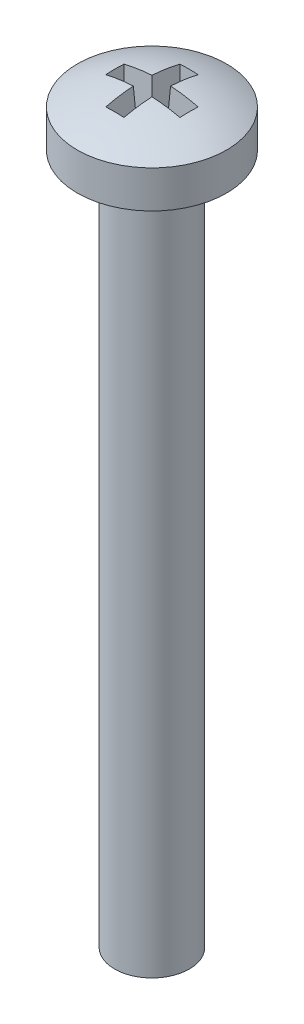
ISO-10303-21;
HEADER;
FILE_DESCRIPTION(('STEP AP214'),'2;1');
FILE_NAME('part.step','',(''),(''),'','','');
FILE_SCHEMA(('AUTOMOTIVE_DESIGN { 1 0 10303 214 1 1 1 1 }'));
ENDSEC;
DATA;
#1=APPLICATION_CONTEXT('core data for automotive mechanical design processes');
#2=APPLICATION_PROTOCOL_DEFINITION('international standard','automotive_design',2000,#1);
#3=PRODUCT_CONTEXT('',#1,'mechanical');
#4=PRODUCT('Part','Part','',(#3));
#5=PRODUCT_RELATED_PRODUCT_CATEGORY('part','',(#4));
#6=PRODUCT_DEFINITION_FORMATION('','',#4);
#7=PRODUCT_DEFINITION_CONTEXT('part definition',#1,'design');
#8=PRODUCT_DEFINITION('design','',#6,#7);
#9=PRODUCT_DEFINITION_SHAPE('','',#8);
#10=(LENGTH_UNIT() NAMED_UNIT(*) SI_UNIT(.MILLI.,.METRE.));
#11=(NAMED_UNIT(*) PLANE_ANGLE_UNIT() SI_UNIT($,.RADIAN.));
#12=(NAMED_UNIT(*) SI_UNIT($,.STERADIAN.) SOLID_ANGLE_UNIT());
#13=UNCERTAINTY_MEASURE_WITH_UNIT(LENGTH_MEASURE(1.E-05),#10,'distance_accuracy_value','');
#14=(GEOMETRIC_REPRESENTATION_CONTEXT(3) GLOBAL_UNCERTAINTY_ASSIGNED_CONTEXT((#13)) GLOBAL_UNIT_ASSIGNED_CONTEXT((#10,
#11,#12)) REPRESENTATION_CONTEXT('',''));
#15=CARTESIAN_POINT('',(0.,0.,0.));
#16=DIRECTION('',(0.,0.,1.));
#17=DIRECTION('',(1.,0.,0.));
#18=AXIS2_PLACEMENT_3D('',#15,#16,#17);
#19=CARTESIAN_POINT('',(0.,31.5,0.));
#20=DIRECTION('',(0.,0.,1.));
#21=DIRECTION('',(1.,0.,0.));
#22=AXIS2_PLACEMENT_3D('',#19,#20,#21);
#23=SPHERICAL_SURFACE('',#22,8.49999999999999);
#24=CARTESIAN_POINT('',(0.,39.,0.));
#25=DIRECTION('',(0.,1.,0.));
#26=DIRECTION('',(0.,0.,1.));
#27=AXIS2_PLACEMENT_3D('',#24,#25,#26);
#28=CIRCLE('',#27,4.);
#29=CARTESIAN_POINT('',(0.,39.,4.));
#30=VERTEX_POINT('',#29);
#31=EDGE_CURVE('E140',#30,#30,#28,.T.);
#32=ORIENTED_EDGE('',*,*,#31,.T.);
#33=EDGE_LOOP('',(#32));
#34=FACE_BOUND('',#33,.T.);
#35=CARTESIAN_POINT('',(0.,31.4187534814172,-1.55027592648074));
#36=DIRECTION('',(0.,-0.0523359562429439,-0.998629534754574));
#37=DIRECTION('',(0.,0.998629534754574,-0.052335956242944));
#38=AXIS2_PLACEMENT_3D('',#35,#36,#37);
#39=CIRCLE('',#38,8.35703557219857);
#40=CARTESIAN_POINT('',(-0.486906393173518,39.7501590984085,-1.98690639317351));
#41=VERTEX_POINT('',#40);
#42=CARTESIAN_POINT('',(0.486906393173518,39.7501590984085,-1.98690639317351));
#43=VERTEX_POINT('',#42);
#44=EDGE_CURVE('E194',#41,#43,#39,.T.);
#45=ORIENTED_EDGE('',*,*,#44,.T.);
#46=CARTESIAN_POINT('',(0.0543845049545404,31.4971498288679,0.));
#47=DIRECTION('',(0.998629534754574,-0.0523359562429439,0.));
#48=DIRECTION('',(0.052335956242944,0.998629534754574,0.));
#49=AXIS2_PLACEMENT_3D('',#46,#47,#48);
#50=CIRCLE('',#49,8.49982553951228);
#51=CARTESIAN_POINT('',(0.498465398677198,39.9707180623984,-0.498465398677195));
#52=VERTEX_POINT('',#51);
#53=EDGE_CURVE('E11',#43,#52,#50,.T.);
#54=ORIENTED_EDGE('',*,*,#53,.T.);
#55=CARTESIAN_POINT('',(0.,31.4971498288679,-0.054384504954538));
#56=DIRECTION('',(0.,-0.0523359562429439,-0.998629534754574));
#57=DIRECTION('',(0.,0.998629534754574,-0.052335956242944));
#58=AXIS2_PLACEMENT_3D('',#55,#56,#57);
#59=CIRCLE('',#58,8.49982553951228);
#60=CARTESIAN_POINT('',(1.98690639317352,39.7501590984085,-0.486906393173514));
#61=VERTEX_POINT('',#60);
#62=EDGE_CURVE('E40',#52,#61,#59,.T.);
#63=ORIENTED_EDGE('',*,*,#62,.T.);
#64=CARTESIAN_POINT('',(1.55027592648075,31.4187534814172,0.));
#65=DIRECTION('',(0.998629534754574,-0.0523359562429439,0.));
#66=DIRECTION('',(0.052335956242944,0.998629534754574,0.));
#67=AXIS2_PLACEMENT_3D('',#64,#65,#66);
#68=CIRCLE('',#67,8.35703557219857);
#69=CARTESIAN_POINT('',(1.98690639317352,39.7501590984085,0.486906393173521));
#70=VERTEX_POINT('',#69);
#71=EDGE_CURVE('E226',#61,#70,#68,.T.);
#72=ORIENTED_EDGE('',*,*,#71,.T.);
#73=CARTESIAN_POINT('',(0.,31.4971498288679,0.0543845049545434));
#74=DIRECTION('',(0.,-0.0523359562429439,0.998629534754574));
#75=DIRECTION('',(0.,-0.998629534754574,-0.052335956242944));
#76=AXIS2_PLACEMENT_3D('',#73,#74,#75);
#77=CIRCLE('',#76,8.49982553951228);
#78=CARTESIAN_POINT('',(0.498465398677197,39.9707180623984,0.498465398677201));
#79=VERTEX_POINT('',#78);
#80=EDGE_CURVE('E223',#70,#79,#77,.T.);
#81=ORIENTED_EDGE('',*,*,#80,.T.);
#82=CARTESIAN_POINT('',(0.0543845049545401,31.4971498288679,0.));
#83=DIRECTION('',(0.998629534754574,-0.0523359562429439,0.));
#84=DIRECTION('',(0.052335956242944,0.998629534754574,0.));
#85=AXIS2_PLACEMENT_3D('',#82,#83,#84);
#86=CIRCLE('',#85,8.49982553951228);
#87=CARTESIAN_POINT('',(0.486906393173517,39.7501590984085,1.98690639317352));
#88=VERTEX_POINT('',#87);
#89=EDGE_CURVE('E220',#79,#88,#86,.T.);
#90=ORIENTED_EDGE('',*,*,#89,.T.);
#91=CARTESIAN_POINT('',(0.,31.4187534814172,1.55027592648075));
#92=DIRECTION('',(0.,-0.0523359562429439,0.998629534754574));
#93=DIRECTION('',(0.,-0.998629534754574,-0.052335956242944));
#94=AXIS2_PLACEMENT_3D('',#91,#92,#93);
#95=CIRCLE('',#94,8.35703557219857);
#96=CARTESIAN_POINT('',(-0.486906393173518,39.7501590984085,1.98690639317352));
#97=VERTEX_POINT('',#96);
#98=EDGE_CURVE('E217',#88,#97,#95,.T.);
#99=ORIENTED_EDGE('',*,*,#98,.T.);
#100=CARTESIAN_POINT('',(-0.0543845049545404,31.4971498288679,0.));
#101=DIRECTION('',(-0.998629534754574,-0.0523359562429439,0.));
#102=DIRECTION('',(0.052335956242944,-0.998629534754574,0.));
#103=AXIS2_PLACEMENT_3D('',#100,#101,#102);
#104=CIRCLE('',#103,8.49982553951228);
#105=CARTESIAN_POINT('',(-0.498465398677198,39.9707180623984,0.4984653986772));
#106=VERTEX_POINT('',#105);
#107=EDGE_CURVE('E214',#97,#106,#104,.T.);
#108=ORIENTED_EDGE('',*,*,#107,.T.);
#109=CARTESIAN_POINT('',(0.,31.4971498288679,0.0543845049545431));
#110=DIRECTION('',(0.,-0.0523359562429439,0.998629534754574));
#111=DIRECTION('',(0.,-0.998629534754574,-0.052335956242944));
#112=AXIS2_PLACEMENT_3D('',#109,#110,#111);
#113=CIRCLE('',#112,8.49982553951228);
#114=CARTESIAN_POINT('',(-1.98690639317352,39.7501590984085,0.48690639317352));
#115=VERTEX_POINT('',#114);
#116=EDGE_CURVE('E211',#106,#115,#113,.T.);
#117=ORIENTED_EDGE('',*,*,#116,.T.);
#118=CARTESIAN_POINT('',(-1.55027592648074,31.4187534814172,0.));
#119=DIRECTION('',(-0.998629534754574,-0.0523359562429439,0.));
#120=DIRECTION('',(0.052335956242944,-0.998629534754574,0.));
#121=AXIS2_PLACEMENT_3D('',#118,#119,#120);
#122=CIRCLE('',#121,8.35703557219857);
#123=CARTESIAN_POINT('',(-1.98690639317352,39.7501590984085,-0.486906393173516));
#124=VERTEX_POINT('',#123);
#125=EDGE_CURVE('E208',#115,#124,#122,.T.);
#126=ORIENTED_EDGE('',*,*,#125,.T.);
#127=CARTESIAN_POINT('',(0.,31.4971498288679,-0.0543845049545381));
#128=DIRECTION('',(0.,-0.0523359562429439,-0.998629534754574));
#129=DIRECTION('',(0.,0.998629534754574,-0.052335956242944));
#130=AXIS2_PLACEMENT_3D('',#127,#128,#129);
#131=CIRCLE('',#130,8.49982553951228);
#132=CARTESIAN_POINT('',(-0.498465398677198,39.9707180623984,-0.498465398677195));
#133=VERTEX_POINT('',#132);
#134=EDGE_CURVE('E205',#124,#133,#131,.T.);
#135=ORIENTED_EDGE('',*,*,#134,.T.);
#136=CARTESIAN_POINT('',(-0.0543845049545404,31.4971498288679,0.));
#137=DIRECTION('',(-0.998629534754574,-0.0523359562429439,0.));
#138=DIRECTION('',(0.052335956242944,-0.998629534754574,0.));
#139=AXIS2_PLACEMENT_3D('',#136,#137,#138);
#140=CIRCLE('',#139,8.49982553951228);
#141=EDGE_CURVE('E202',#133,#41,#140,.T.);
#142=ORIENTED_EDGE('',*,*,#141,.T.);
#143=EDGE_LOOP('',(#45,#54,#63,#72,#81,#90,#99,#108,#117,#126,#135,#142));
#144=FACE_BOUND('',#143,.T.);
#145=ADVANCED_FACE('F33',(#34,#144),#23,.T.);
#146=CARTESIAN_POINT('',(0.,37.,0.));
#147=DIRECTION('',(0.,-1.,0.));
#148=DIRECTION('',(0.,0.,-1.));
#149=AXIS2_PLACEMENT_3D('',#146,#147,#148);
#150=CYLINDRICAL_SURFACE('',#149,2.);
#151=CARTESIAN_POINT('',(0.,37.,0.));
#152=DIRECTION('',(0.,1.,0.));
#153=DIRECTION('',(0.,0.,1.));
#154=AXIS2_PLACEMENT_3D('',#151,#152,#153);
#155=CIRCLE('',#154,2.);
#156=CARTESIAN_POINT('',(0.,37.,2.));
#157=VERTEX_POINT('',#156);
#158=EDGE_CURVE('E191',#157,#157,#155,.T.);
#159=ORIENTED_EDGE('',*,*,#158,.F.);
#160=EDGE_LOOP('',(#159));
#161=FACE_BOUND('',#160,.T.);
#162=CARTESIAN_POINT('',(0.,0.,0.));
#163=DIRECTION('',(0.,1.,0.));
#164=DIRECTION('',(0.,0.,1.));
#165=AXIS2_PLACEMENT_3D('',#162,#163,#164);
#166=CIRCLE('',#165,2.);
#167=CARTESIAN_POINT('',(0.,0.,2.));
#168=VERTEX_POINT('',#167);
#169=EDGE_CURVE('E195',#168,#168,#166,.T.);
#170=ORIENTED_EDGE('',*,*,#169,.T.);
#171=EDGE_LOOP('',(#170));
#172=FACE_BOUND('',#171,.T.);
#173=ADVANCED_FACE('F273',(#161,#172),#150,.T.);
#174=CARTESIAN_POINT('',(0.,0.,0.));
#175=DIRECTION('',(0.,1.,0.));
#176=DIRECTION('',(0.,0.,1.));
#177=AXIS2_PLACEMENT_3D('',#174,#175,#176);
#178=PLANE('',#177);
#179=ORIENTED_EDGE('',*,*,#169,.F.);
#180=EDGE_LOOP('',(#179));
#181=FACE_BOUND('',#180,.T.);
#182=ADVANCED_FACE('F278',(#181),#178,.F.);
#183=CARTESIAN_POINT('',(0.,39.,0.));
#184=DIRECTION('',(0.,-1.,0.));
#185=DIRECTION('',(0.,0.,-1.));
#186=AXIS2_PLACEMENT_3D('',#183,#184,#185);
#187=CYLINDRICAL_SURFACE('',#186,4.);
#188=ORIENTED_EDGE('',*,*,#31,.F.);
#189=EDGE_LOOP('',(#188));
#190=FACE_BOUND('',#189,.T.);
#191=CARTESIAN_POINT('',(0.,37.,0.));
#192=DIRECTION('',(0.,1.,0.));
#193=DIRECTION('',(0.,0.,1.));
#194=AXIS2_PLACEMENT_3D('',#191,#192,#193);
#195=CIRCLE('',#194,4.);
#196=CARTESIAN_POINT('',(0.,37.,4.));
#197=VERTEX_POINT('',#196);
#198=EDGE_CURVE('E136',#197,#197,#195,.T.);
#199=ORIENTED_EDGE('',*,*,#198,.T.);
#200=EDGE_LOOP('',(#199));
#201=FACE_BOUND('',#200,.T.);
#202=ADVANCED_FACE('F282',(#190,#201),#187,.T.);
#203=CARTESIAN_POINT('',(0.,37.,0.));
#204=DIRECTION('',(0.,1.,0.));
#205=DIRECTION('',(0.,0.,1.));
#206=AXIS2_PLACEMENT_3D('',#203,#204,#205);
#207=PLANE('',#206);
#208=ORIENTED_EDGE('',*,*,#158,.T.);
#209=EDGE_LOOP('',(#208));
#210=FACE_BOUND('',#209,.T.);
#211=ORIENTED_EDGE('',*,*,#198,.F.);
#212=EDGE_LOOP('',(#211));
#213=FACE_BOUND('',#212,.T.);
#214=ADVANCED_FACE('F285',(#210,#213),#207,.F.);
#215=CARTESIAN_POINT('',(0.5,40.,-0.499999999999997));
#216=DIRECTION('',(0.998629534754574,-0.0523359562429439,0.));
#217=DIRECTION('',(0.052335956242944,0.998629534754574,0.));
#218=AXIS2_PLACEMENT_3D('',#215,#216,#217);
#219=PLANE('',#218);
#220=DIRECTION('',(0.052264427688714,0.997264688634237,-0.052264427688714));
#221=VECTOR('',#220,1.);
#222=CARTESIAN_POINT('',(0.495902644397557,39.9218177976916,-1.99590264439755));
#223=LINE('',#222,#221);
#224=CARTESIAN_POINT('',(0.342776662150876,37.,-1.84277666215087));
#225=VERTEX_POINT('',#224);
#226=EDGE_CURVE('E47',#225,#43,#223,.T.);
#227=ORIENTED_EDGE('',*,*,#226,.F.);
#228=DIRECTION('',(0.,0.,-1.));
#229=VECTOR('',#228,1.);
#230=CARTESIAN_POINT('',(0.342776662150876,37.,-0.499999999999997));
#231=LINE('',#230,#229);
#232=CARTESIAN_POINT('',(0.342776662150876,37.,-0.342776662150873));
#233=VERTEX_POINT('',#232);
#234=EDGE_CURVE('E126',#225,#233,#231,.F.);
#235=ORIENTED_EDGE('',*,*,#234,.T.);
#236=DIRECTION('',(0.052264427688714,0.997264688634237,-0.052264427688714));
#237=VECTOR('',#236,1.);
#238=CARTESIAN_POINT('',(0.5,40.,-0.499999999999997));
#239=LINE('',#238,#237);
#240=EDGE_CURVE('E133',#233,#52,#239,.T.);
#241=ORIENTED_EDGE('',*,*,#240,.T.);
#242=ORIENTED_EDGE('',*,*,#53,.F.);
#243=EDGE_LOOP('',(#227,#235,#241,#242));
#244=FACE_BOUND('',#243,.T.);
#245=ADVANCED_FACE('F132',(#244),#219,.F.);
#246=CARTESIAN_POINT('',(0.5,40.,-0.499999999999997));
#247=DIRECTION('',(0.,-0.0523359562429439,-0.998629534754574));
#248=DIRECTION('',(0.,0.998629534754574,-0.052335956242944));
#249=AXIS2_PLACEMENT_3D('',#246,#247,#248);
#250=PLANE('',#249);
#251=ORIENTED_EDGE('',*,*,#240,.F.);
#252=DIRECTION('',(-1.,0.,0.));
#253=VECTOR('',#252,1.);
#254=CARTESIAN_POINT('',(0.5,37.,-0.342776662150873));
#255=LINE('',#254,#253);
#256=CARTESIAN_POINT('',(1.84277666215088,37.,-0.342776662150873));
#257=VERTEX_POINT('',#256);
#258=EDGE_CURVE('E122',#233,#257,#255,.F.);
#259=ORIENTED_EDGE('',*,*,#258,.T.);
#260=DIRECTION('',(0.052264427688714,0.997264688634237,-0.052264427688714));
#261=VECTOR('',#260,1.);
#262=CARTESIAN_POINT('',(1.99726842959837,39.9478785317944,-0.497268429598368));
#263=LINE('',#262,#261);
#264=EDGE_CURVE('E137',#257,#61,#263,.T.);
#265=ORIENTED_EDGE('',*,*,#264,.T.);
#266=ORIENTED_EDGE('',*,*,#62,.F.);
#267=EDGE_LOOP('',(#251,#259,#265,#266));
#268=FACE_BOUND('',#267,.T.);
#269=ADVANCED_FACE('F135',(#268),#250,.F.);
#270=CARTESIAN_POINT('',(2.,40.,0.500000000000003));
#271=DIRECTION('',(0.998629534754574,-0.0523359562429439,0.));
#272=DIRECTION('',(0.052335956242944,0.998629534754574,0.));
#273=AXIS2_PLACEMENT_3D('',#270,#271,#272);
#274=PLANE('',#273);
#275=ORIENTED_EDGE('',*,*,#264,.F.);
#276=DIRECTION('',(0.,0.,-1.));
#277=VECTOR('',#276,1.);
#278=CARTESIAN_POINT('',(1.84277666215088,37.,0.500000000000003));
#279=LINE('',#278,#277);
#280=CARTESIAN_POINT('',(1.84277666215088,37.,0.342776662150879));
#281=VERTEX_POINT('',#280);
#282=EDGE_CURVE('E128',#257,#281,#279,.F.);
#283=ORIENTED_EDGE('',*,*,#282,.T.);
#284=DIRECTION('',(0.052264427688714,0.997264688634237,0.052264427688714));
#285=VECTOR('',#284,1.);
#286=CARTESIAN_POINT('',(1.99590264439756,39.9218177976916,0.49590264439756));
#287=LINE('',#286,#285);
#288=EDGE_CURVE('E142',#281,#70,#287,.T.);
#289=ORIENTED_EDGE('',*,*,#288,.T.);
#290=ORIENTED_EDGE('',*,*,#71,.F.);
#291=EDGE_LOOP('',(#275,#283,#289,#290));
#292=FACE_BOUND('',#291,.T.);
#293=ADVANCED_FACE('F263',(#292),#274,.F.);
#294=CARTESIAN_POINT('',(0.5,40.,0.500000000000003));
#295=DIRECTION('',(0.,-0.0523359562429439,0.998629534754574));
#296=DIRECTION('',(0.,-0.998629534754574,-0.052335956242944));
#297=AXIS2_PLACEMENT_3D('',#294,#295,#296);
#298=PLANE('',#297);
#299=ORIENTED_EDGE('',*,*,#288,.F.);
#300=DIRECTION('',(1.,0.,0.));
#301=VECTOR('',#300,1.);
#302=CARTESIAN_POINT('',(0.5,37.,0.342776662150879));
#303=LINE('',#302,#301);
#304=CARTESIAN_POINT('',(0.342776662150876,37.,0.342776662150879));
#305=VERTEX_POINT('',#304);
#306=EDGE_CURVE('E174',#281,#305,#303,.F.);
#307=ORIENTED_EDGE('',*,*,#306,.T.);
#308=DIRECTION('',(0.052264427688714,0.997264688634237,0.052264427688714));
#309=VECTOR('',#308,1.);
#310=CARTESIAN_POINT('',(0.5,40.,0.500000000000003));
#311=LINE('',#310,#309);
#312=EDGE_CURVE('E168',#305,#79,#311,.T.);
#313=ORIENTED_EDGE('',*,*,#312,.T.);
#314=ORIENTED_EDGE('',*,*,#80,.F.);
#315=EDGE_LOOP('',(#299,#307,#313,#314));
#316=FACE_BOUND('',#315,.T.);
#317=ADVANCED_FACE('F261',(#316),#298,.F.);
#318=CARTESIAN_POINT('',(0.5,40.,2.));
#319=DIRECTION('',(0.998629534754574,-0.0523359562429439,0.));
#320=DIRECTION('',(0.052335956242944,0.998629534754574,0.));
#321=AXIS2_PLACEMENT_3D('',#318,#319,#320);
#322=PLANE('',#321);
#323=ORIENTED_EDGE('',*,*,#312,.F.);
#324=DIRECTION('',(0.,0.,-1.));
#325=VECTOR('',#324,1.);
#326=CARTESIAN_POINT('',(0.342776662150876,37.,2.));
#327=LINE('',#326,#325);
#328=CARTESIAN_POINT('',(0.342776662150876,37.,1.84277666215088));
#329=VERTEX_POINT('',#328);
#330=EDGE_CURVE('E176',#305,#329,#327,.F.);
#331=ORIENTED_EDGE('',*,*,#330,.T.);
#332=DIRECTION('',(0.052264427688714,0.997264688634237,0.052264427688714));
#333=VECTOR('',#332,1.);
#334=CARTESIAN_POINT('',(0.497268429598371,39.9478785317944,1.99726842959837));
#335=LINE('',#334,#333);
#336=EDGE_CURVE('E165',#329,#88,#335,.T.);
#337=ORIENTED_EDGE('',*,*,#336,.T.);
#338=ORIENTED_EDGE('',*,*,#89,.F.);
#339=EDGE_LOOP('',(#323,#331,#337,#338));
#340=FACE_BOUND('',#339,.T.);
#341=ADVANCED_FACE('F258',(#340),#322,.F.);
#342=CARTESIAN_POINT('',(-0.5,40.,2.));
#343=DIRECTION('',(0.,-0.0523359562429439,0.998629534754574));
#344=DIRECTION('',(0.,-0.998629534754574,-0.052335956242944));
#345=AXIS2_PLACEMENT_3D('',#342,#343,#344);
#346=PLANE('',#345);
#347=ORIENTED_EDGE('',*,*,#336,.F.);
#348=DIRECTION('',(1.,0.,0.));
#349=VECTOR('',#348,1.);
#350=CARTESIAN_POINT('',(-0.5,37.,1.84277666215088));
#351=LINE('',#350,#349);
#352=CARTESIAN_POINT('',(-0.342776662150876,37.,1.84277666215088));
#353=VERTEX_POINT('',#352);
#354=EDGE_CURVE('E178',#329,#353,#351,.F.);
#355=ORIENTED_EDGE('',*,*,#354,.T.);
#356=DIRECTION('',(-0.052264427688714,0.997264688634237,0.052264427688714));
#357=VECTOR('',#356,1.);
#358=CARTESIAN_POINT('',(-0.5,40.,2.));
#359=LINE('',#358,#357);
#360=EDGE_CURVE('E162',#353,#97,#359,.T.);
#361=ORIENTED_EDGE('',*,*,#360,.T.);
#362=ORIENTED_EDGE('',*,*,#98,.F.);
#363=EDGE_LOOP('',(#347,#355,#361,#362));
#364=FACE_BOUND('',#363,.T.);
#365=ADVANCED_FACE('F255',(#364),#346,.F.);
#366=CARTESIAN_POINT('',(-0.5,40.,2.));
#367=DIRECTION('',(-0.998629534754574,-0.0523359562429439,0.));
#368=DIRECTION('',(0.052335956242944,-0.998629534754574,0.));
#369=AXIS2_PLACEMENT_3D('',#366,#367,#368);
#370=PLANE('',#369);
#371=ORIENTED_EDGE('',*,*,#360,.F.);
#372=DIRECTION('',(0.,0.,1.));
#373=VECTOR('',#372,1.);
#374=CARTESIAN_POINT('',(-0.342776662150876,37.,2.));
#375=LINE('',#374,#373);
#376=CARTESIAN_POINT('',(-0.342776662150876,37.,0.342776662150879));
#377=VERTEX_POINT('',#376);
#378=EDGE_CURVE('E180',#353,#377,#375,.F.);
#379=ORIENTED_EDGE('',*,*,#378,.T.);
#380=DIRECTION('',(-0.052264427688714,0.997264688634237,0.052264427688714));
#381=VECTOR('',#380,1.);
#382=CARTESIAN_POINT('',(-0.504097355602443,40.0781822023085,0.504097355602446));
#383=LINE('',#382,#381);
#384=EDGE_CURVE('E159',#377,#106,#383,.T.);
#385=ORIENTED_EDGE('',*,*,#384,.T.);
#386=ORIENTED_EDGE('',*,*,#107,.F.);
#387=EDGE_LOOP('',(#371,#379,#385,#386));
#388=FACE_BOUND('',#387,.T.);
#389=ADVANCED_FACE('F249',(#388),#370,.F.);
#390=CARTESIAN_POINT('',(-2.,40.,0.500000000000003));
#391=DIRECTION('',(0.,-0.0523359562429439,0.998629534754574));
#392=DIRECTION('',(0.,-0.998629534754574,-0.052335956242944));
#393=AXIS2_PLACEMENT_3D('',#390,#391,#392);
#394=PLANE('',#393);
#395=ORIENTED_EDGE('',*,*,#384,.F.);
#396=DIRECTION('',(1.,0.,0.));
#397=VECTOR('',#396,1.);
#398=CARTESIAN_POINT('',(-2.,37.,0.342776662150878));
#399=LINE('',#398,#397);
#400=CARTESIAN_POINT('',(-1.84277666215088,37.,0.342776662150878));
#401=VERTEX_POINT('',#400);
#402=EDGE_CURVE('E182',#377,#401,#399,.F.);
#403=ORIENTED_EDGE('',*,*,#402,.T.);
#404=DIRECTION('',(-0.052264427688714,0.997264688634237,0.052264427688714));
#405=VECTOR('',#404,1.);
#406=CARTESIAN_POINT('',(-2.,40.,0.500000000000003));
#407=LINE('',#406,#405);
#408=EDGE_CURVE('E156',#401,#115,#407,.T.);
#409=ORIENTED_EDGE('',*,*,#408,.T.);
#410=ORIENTED_EDGE('',*,*,#116,.F.);
#411=EDGE_LOOP('',(#395,#403,#409,#410));
#412=FACE_BOUND('',#411,.T.);
#413=ADVANCED_FACE('F246',(#412),#394,.F.);
#414=CARTESIAN_POINT('',(-2.,40.,0.500000000000003));
#415=DIRECTION('',(-0.998629534754574,-0.0523359562429439,0.));
#416=DIRECTION('',(0.052335956242944,-0.998629534754574,0.));
#417=AXIS2_PLACEMENT_3D('',#414,#415,#416);
#418=PLANE('',#417);
#419=ORIENTED_EDGE('',*,*,#408,.F.);
#420=DIRECTION('',(0.,0.,1.));
#421=VECTOR('',#420,1.);
#422=CARTESIAN_POINT('',(-1.84277666215088,37.,0.500000000000003));
#423=LINE('',#422,#421);
#424=CARTESIAN_POINT('',(-1.84277666215088,37.,-0.342776662150874));
#425=VERTEX_POINT('',#424);
#426=EDGE_CURVE('E184',#401,#425,#423,.F.);
#427=ORIENTED_EDGE('',*,*,#426,.T.);
#428=DIRECTION('',(-0.052264427688714,0.997264688634237,-0.052264427688714));
#429=VECTOR('',#428,1.);
#430=CARTESIAN_POINT('',(-2.,40.,-0.499999999999998));
#431=LINE('',#430,#429);
#432=EDGE_CURVE('E153',#425,#124,#431,.T.);
#433=ORIENTED_EDGE('',*,*,#432,.T.);
#434=ORIENTED_EDGE('',*,*,#125,.F.);
#435=EDGE_LOOP('',(#419,#427,#433,#434));
#436=FACE_BOUND('',#435,.T.);
#437=ADVANCED_FACE('F243',(#436),#418,.F.);
#438=CARTESIAN_POINT('',(-2.,40.,-0.499999999999998));
#439=DIRECTION('',(0.,-0.0523359562429439,-0.998629534754574));
#440=DIRECTION('',(0.,0.998629534754574,-0.052335956242944));
#441=AXIS2_PLACEMENT_3D('',#438,#439,#440);
#442=PLANE('',#441);
#443=ORIENTED_EDGE('',*,*,#432,.F.);
#444=DIRECTION('',(-1.,0.,0.));
#445=VECTOR('',#444,1.);
#446=CARTESIAN_POINT('',(-2.,37.,-0.342776662150874));
#447=LINE('',#446,#445);
#448=CARTESIAN_POINT('',(-0.342776662150876,37.,-0.342776662150874));
#449=VERTEX_POINT('',#448);
#450=EDGE_CURVE('E186',#425,#449,#447,.F.);
#451=ORIENTED_EDGE('',*,*,#450,.T.);
#452=DIRECTION('',(-0.052264427688714,0.997264688634237,-0.052264427688714));
#453=VECTOR('',#452,1.);
#454=CARTESIAN_POINT('',(-0.504097355602443,40.0781822023085,-0.504097355602441));
#455=LINE('',#454,#453);
#456=EDGE_CURVE('E150',#449,#133,#455,.T.);
#457=ORIENTED_EDGE('',*,*,#456,.T.);
#458=ORIENTED_EDGE('',*,*,#134,.F.);
#459=EDGE_LOOP('',(#443,#451,#457,#458));
#460=FACE_BOUND('',#459,.T.);
#461=ADVANCED_FACE('F240',(#460),#442,.F.);
#462=CARTESIAN_POINT('',(-0.5,40.,-0.499999999999998));
#463=DIRECTION('',(-0.998629534754574,-0.0523359562429439,0.));
#464=DIRECTION('',(0.052335956242944,-0.998629534754574,0.));
#465=AXIS2_PLACEMENT_3D('',#462,#463,#464);
#466=PLANE('',#465);
#467=ORIENTED_EDGE('',*,*,#456,.F.);
#468=DIRECTION('',(0.,0.,1.));
#469=VECTOR('',#468,1.);
#470=CARTESIAN_POINT('',(-0.342776662150876,37.,-0.499999999999998));
#471=LINE('',#470,#469);
#472=CARTESIAN_POINT('',(-0.342776662150876,37.,-1.84277666215087));
#473=VERTEX_POINT('',#472);
#474=EDGE_CURVE('E188',#449,#473,#471,.F.);
#475=ORIENTED_EDGE('',*,*,#474,.T.);
#476=DIRECTION('',(-0.052264427688714,0.997264688634237,-0.052264427688714));
#477=VECTOR('',#476,1.);
#478=CARTESIAN_POINT('',(-0.5,40.,-2.));
#479=LINE('',#478,#477);
#480=EDGE_CURVE('E146',#473,#41,#479,.T.);
#481=ORIENTED_EDGE('',*,*,#480,.T.);
#482=ORIENTED_EDGE('',*,*,#141,.F.);
#483=EDGE_LOOP('',(#467,#475,#481,#482));
#484=FACE_BOUND('',#483,.T.);
#485=ADVANCED_FACE('F233',(#484),#466,.F.);
#486=CARTESIAN_POINT('',(-0.5,40.,-2.));
#487=DIRECTION('',(0.,-0.0523359562429439,-0.998629534754574));
#488=DIRECTION('',(0.,0.998629534754574,-0.052335956242944));
#489=AXIS2_PLACEMENT_3D('',#486,#487,#488);
#490=PLANE('',#489);
#491=ORIENTED_EDGE('',*,*,#480,.F.);
#492=DIRECTION('',(-1.,0.,0.));
#493=VECTOR('',#492,1.);
#494=CARTESIAN_POINT('',(-0.5,37.,-1.84277666215087));
#495=LINE('',#494,#493);
#496=EDGE_CURVE('E147',#473,#225,#495,.F.);
#497=ORIENTED_EDGE('',*,*,#496,.T.);
#498=ORIENTED_EDGE('',*,*,#226,.T.);
#499=ORIENTED_EDGE('',*,*,#44,.F.);
#500=EDGE_LOOP('',(#491,#497,#498,#499));
#501=FACE_BOUND('',#500,.T.);
#502=ADVANCED_FACE('F230',(#501),#490,.F.);
#503=CARTESIAN_POINT('',(0.,37.,0.));
#504=DIRECTION('',(0.,-1.,0.));
#505=DIRECTION('',(0.,0.,-1.));
#506=AXIS2_PLACEMENT_3D('',#503,#504,#505);
#507=PLANE('',#506);
#508=ORIENTED_EDGE('',*,*,#234,.F.);
#509=ORIENTED_EDGE('',*,*,#496,.F.);
#510=ORIENTED_EDGE('',*,*,#474,.F.);
#511=ORIENTED_EDGE('',*,*,#450,.F.);
#512=ORIENTED_EDGE('',*,*,#426,.F.);
#513=ORIENTED_EDGE('',*,*,#402,.F.);
#514=ORIENTED_EDGE('',*,*,#378,.F.);
#515=ORIENTED_EDGE('',*,*,#354,.F.);
#516=ORIENTED_EDGE('',*,*,#330,.F.);
#517=ORIENTED_EDGE('',*,*,#306,.F.);
#518=ORIENTED_EDGE('',*,*,#282,.F.);
#519=ORIENTED_EDGE('',*,*,#258,.F.);
#520=EDGE_LOOP('',(#508,#509,#510,#511,#512,#513,#514,#515,#516,#517,#518,#519));
#521=FACE_BOUND('',#520,.T.);
#522=ADVANCED_FACE('F124',(#521),#507,.F.);
#523=CLOSED_SHELL('',(#145,#173,#182,#202,#214,#245,#269,#293,#317,#341,#365,#389,#413,#437,
#461,#485,#502,#522));
#524=MANIFOLD_SOLID_BREP('B2',#523);
#525=ADVANCED_BREP_SHAPE_REPRESENTATION('',(#18,#524),#14);
#526=SHAPE_DEFINITION_REPRESENTATION(#9,#525);
ENDSEC;
END-ISO-10303-21;
